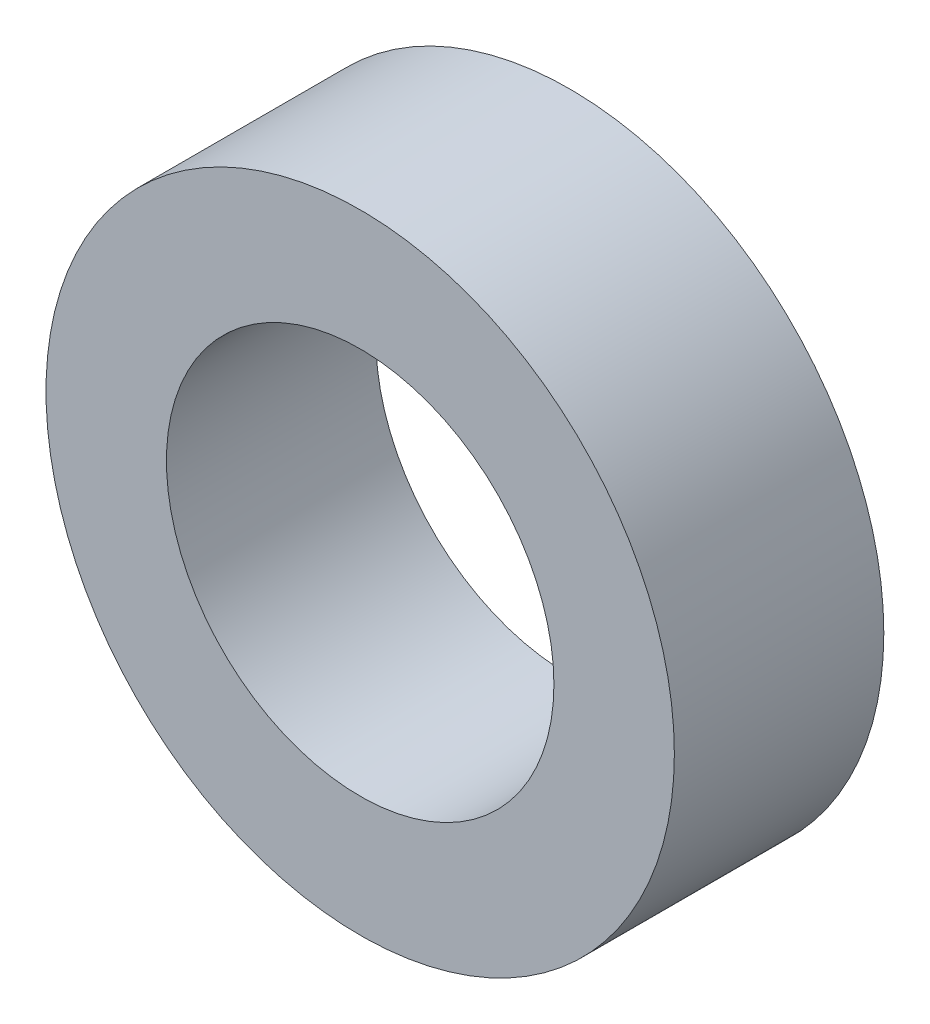
ISO-10303-21;
HEADER;
FILE_DESCRIPTION(('STEP AP214'),'2;1');
FILE_NAME('part.step','',(''),(''),'','','');
FILE_SCHEMA(('AUTOMOTIVE_DESIGN { 1 0 10303 214 1 1 1 1 }'));
ENDSEC;
DATA;
#1=APPLICATION_CONTEXT('core data for automotive mechanical design processes');
#2=APPLICATION_PROTOCOL_DEFINITION('international standard','automotive_design',2000,#1);
#3=PRODUCT_CONTEXT('',#1,'mechanical');
#4=PRODUCT('Part','Part','',(#3));
#5=PRODUCT_RELATED_PRODUCT_CATEGORY('part','',(#4));
#6=PRODUCT_DEFINITION_FORMATION('','',#4);
#7=PRODUCT_DEFINITION_CONTEXT('part definition',#1,'design');
#8=PRODUCT_DEFINITION('design','',#6,#7);
#9=PRODUCT_DEFINITION_SHAPE('','',#8);
#10=(LENGTH_UNIT() NAMED_UNIT(*) SI_UNIT(.MILLI.,.METRE.));
#11=(NAMED_UNIT(*) PLANE_ANGLE_UNIT() SI_UNIT($,.RADIAN.));
#12=(NAMED_UNIT(*) SI_UNIT($,.STERADIAN.) SOLID_ANGLE_UNIT());
#13=UNCERTAINTY_MEASURE_WITH_UNIT(LENGTH_MEASURE(1.E-05),#10,'distance_accuracy_value','');
#14=(GEOMETRIC_REPRESENTATION_CONTEXT(3) GLOBAL_UNCERTAINTY_ASSIGNED_CONTEXT((#13)) GLOBAL_UNIT_ASSIGNED_CONTEXT((#10,
#11,#12)) REPRESENTATION_CONTEXT('',''));
#15=CARTESIAN_POINT('',(0.,0.,0.));
#16=DIRECTION('',(0.,0.,1.));
#17=DIRECTION('',(1.,0.,0.));
#18=AXIS2_PLACEMENT_3D('',#15,#16,#17);
#19=CARTESIAN_POINT('',(0.,0.,2.));
#20=DIRECTION('',(0.,0.,1.));
#21=DIRECTION('',(1.,0.,0.));
#22=AXIS2_PLACEMENT_3D('',#19,#20,#21);
#23=PLANE('',#22);
#24=CARTESIAN_POINT('',(0.,0.,2.));
#25=DIRECTION('',(0.,0.,1.));
#26=DIRECTION('',(1.,0.,0.));
#27=AXIS2_PLACEMENT_3D('',#24,#25,#26);
#28=CIRCLE('',#27,3.);
#29=CARTESIAN_POINT('',(3.,0.,2.));
#30=VERTEX_POINT('',#29);
#31=EDGE_CURVE('E10',#30,#30,#28,.T.);
#32=ORIENTED_EDGE('',*,*,#31,.T.);
#33=EDGE_LOOP('',(#32));
#34=FACE_BOUND('',#33,.T.);
#35=CARTESIAN_POINT('',(0.,0.,2.));
#36=DIRECTION('',(0.,0.,1.));
#37=DIRECTION('',(1.,0.,0.));
#38=AXIS2_PLACEMENT_3D('',#35,#36,#37);
#39=CIRCLE('',#38,1.85);
#40=CARTESIAN_POINT('',(1.85,0.,2.));
#41=VERTEX_POINT('',#40);
#42=EDGE_CURVE('E44',#41,#41,#39,.T.);
#43=ORIENTED_EDGE('',*,*,#42,.F.);
#44=EDGE_LOOP('',(#43));
#45=FACE_BOUND('',#44,.T.);
#46=ADVANCED_FACE('F33',(#34,#45),#23,.T.);
#47=CARTESIAN_POINT('',(0.,0.,0.));
#48=DIRECTION('',(0.,0.,1.));
#49=DIRECTION('',(1.,0.,0.));
#50=AXIS2_PLACEMENT_3D('',#47,#48,#49);
#51=PLANE('',#50);
#52=CARTESIAN_POINT('',(0.,0.,0.));
#53=DIRECTION('',(0.,0.,1.));
#54=DIRECTION('',(1.,0.,0.));
#55=AXIS2_PLACEMENT_3D('',#52,#53,#54);
#56=CIRCLE('',#55,3.);
#57=CARTESIAN_POINT('',(3.,0.,0.));
#58=VERTEX_POINT('',#57);
#59=EDGE_CURVE('E37',#58,#58,#56,.T.);
#60=ORIENTED_EDGE('',*,*,#59,.F.);
#61=EDGE_LOOP('',(#60));
#62=FACE_BOUND('',#61,.T.);
#63=CARTESIAN_POINT('',(0.,0.,0.));
#64=DIRECTION('',(0.,0.,1.));
#65=DIRECTION('',(1.,0.,0.));
#66=AXIS2_PLACEMENT_3D('',#63,#64,#65);
#67=CIRCLE('',#66,1.85);
#68=CARTESIAN_POINT('',(1.85,0.,0.));
#69=VERTEX_POINT('',#68);
#70=EDGE_CURVE('E46',#69,#69,#67,.T.);
#71=ORIENTED_EDGE('',*,*,#70,.T.);
#72=EDGE_LOOP('',(#71));
#73=FACE_BOUND('',#72,.T.);
#74=ADVANCED_FACE('F56',(#62,#73),#51,.F.);
#75=CARTESIAN_POINT('',(0.,0.,2.));
#76=DIRECTION('',(0.,0.,-1.));
#77=DIRECTION('',(-1.,0.,0.));
#78=AXIS2_PLACEMENT_3D('',#75,#76,#77);
#79=CYLINDRICAL_SURFACE('',#78,3.);
#80=ORIENTED_EDGE('',*,*,#31,.F.);
#81=EDGE_LOOP('',(#80));
#82=FACE_BOUND('',#81,.T.);
#83=ORIENTED_EDGE('',*,*,#59,.T.);
#84=EDGE_LOOP('',(#83));
#85=FACE_BOUND('',#84,.T.);
#86=ADVANCED_FACE('F35',(#82,#85),#79,.T.);
#87=CARTESIAN_POINT('',(0.,0.,2.));
#88=DIRECTION('',(0.,0.,-1.));
#89=DIRECTION('',(-1.,0.,0.));
#90=AXIS2_PLACEMENT_3D('',#87,#88,#89);
#91=CYLINDRICAL_SURFACE('',#90,1.85);
#92=ORIENTED_EDGE('',*,*,#42,.T.);
#93=EDGE_LOOP('',(#92));
#94=FACE_BOUND('',#93,.T.);
#95=ORIENTED_EDGE('',*,*,#70,.F.);
#96=EDGE_LOOP('',(#95));
#97=FACE_BOUND('',#96,.T.);
#98=ADVANCED_FACE('F52',(#94,#97),#91,.F.);
#99=CLOSED_SHELL('',(#46,#74,#86,#98));
#100=MANIFOLD_SOLID_BREP('B2',#99);
#101=ADVANCED_BREP_SHAPE_REPRESENTATION('',(#18,#100),#14);
#102=SHAPE_DEFINITION_REPRESENTATION(#9,#101);
ENDSEC;
END-ISO-10303-21;
